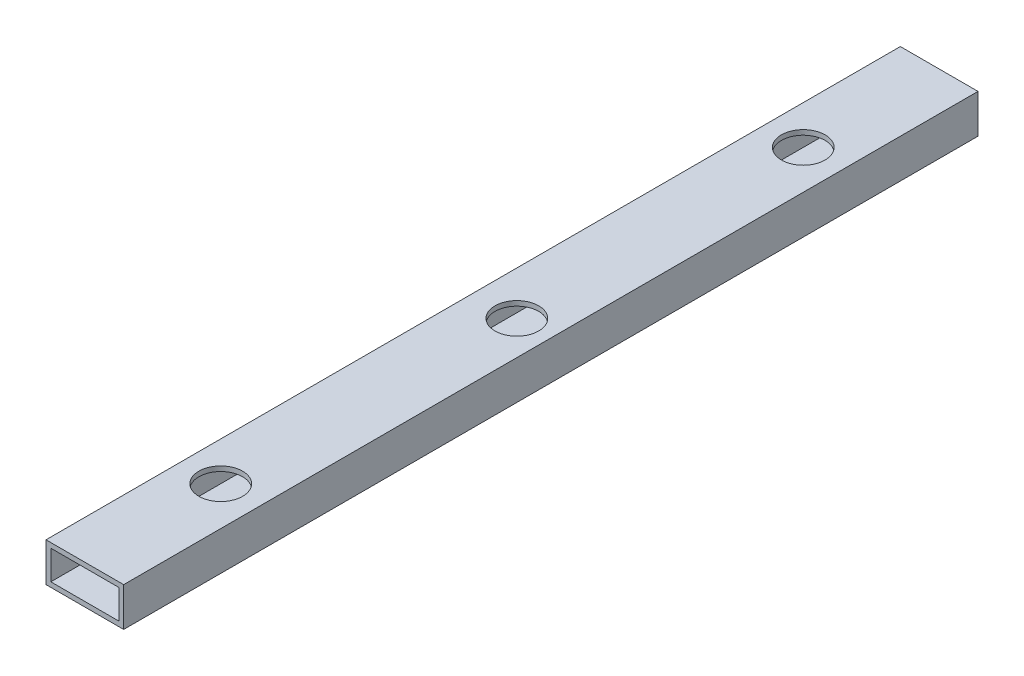
ISO-10303-21;
HEADER;
FILE_DESCRIPTION(('STEP AP214'),'2;1');
FILE_NAME('part.step','',(''),(''),'','','');
FILE_SCHEMA(('AUTOMOTIVE_DESIGN { 1 0 10303 214 1 1 1 1 }'));
ENDSEC;
DATA;
#1=APPLICATION_CONTEXT('core data for automotive mechanical design processes');
#2=APPLICATION_PROTOCOL_DEFINITION('international standard','automotive_design',2000,#1);
#3=PRODUCT_CONTEXT('',#1,'mechanical');
#4=PRODUCT('Part','Part','',(#3));
#5=PRODUCT_RELATED_PRODUCT_CATEGORY('part','',(#4));
#6=PRODUCT_DEFINITION_FORMATION('','',#4);
#7=PRODUCT_DEFINITION_CONTEXT('part definition',#1,'design');
#8=PRODUCT_DEFINITION('design','',#6,#7);
#9=PRODUCT_DEFINITION_SHAPE('','',#8);
#10=(LENGTH_UNIT() NAMED_UNIT(*) SI_UNIT(.MILLI.,.METRE.));
#11=(NAMED_UNIT(*) PLANE_ANGLE_UNIT() SI_UNIT($,.RADIAN.));
#12=(NAMED_UNIT(*) SI_UNIT($,.STERADIAN.) SOLID_ANGLE_UNIT());
#13=UNCERTAINTY_MEASURE_WITH_UNIT(LENGTH_MEASURE(1.E-05),#10,'distance_accuracy_value','');
#14=(GEOMETRIC_REPRESENTATION_CONTEXT(3) GLOBAL_UNCERTAINTY_ASSIGNED_CONTEXT((#13)) GLOBAL_UNIT_ASSIGNED_CONTEXT((#10,
#11,#12)) REPRESENTATION_CONTEXT('',''));
#15=CARTESIAN_POINT('',(0.,0.,0.));
#16=DIRECTION('',(0.,0.,1.));
#17=DIRECTION('',(1.,0.,0.));
#18=AXIS2_PLACEMENT_3D('',#15,#16,#17);
#19=CARTESIAN_POINT('',(0.,0.,558.8));
#20=DIRECTION('',(0.,0.,-1.));
#21=DIRECTION('',(-1.,0.,0.));
#22=AXIS2_PLACEMENT_3D('',#19,#20,#21);
#23=PLANE('',#22);
#24=DIRECTION('',(0.,-1.,0.));
#25=VECTOR('',#24,1.);
#26=CARTESIAN_POINT('',(0.,0.,558.8));
#27=LINE('',#26,#25);
#28=CARTESIAN_POINT('',(0.,25.4,558.8));
#29=VERTEX_POINT('',#28);
#30=CARTESIAN_POINT('',(0.,0.,558.8));
#31=VERTEX_POINT('',#30);
#32=EDGE_CURVE('E138',#29,#31,#27,.T.);
#33=ORIENTED_EDGE('',*,*,#32,.T.);
#34=DIRECTION('',(1.,0.,0.));
#35=VECTOR('',#34,1.);
#36=CARTESIAN_POINT('',(0.,0.,558.8));
#37=LINE('',#36,#35);
#38=CARTESIAN_POINT('',(50.8,0.,558.8));
#39=VERTEX_POINT('',#38);
#40=EDGE_CURVE('E141',#31,#39,#37,.T.);
#41=ORIENTED_EDGE('',*,*,#40,.T.);
#42=DIRECTION('',(0.,1.,0.));
#43=VECTOR('',#42,1.);
#44=CARTESIAN_POINT('',(50.8,0.,558.8));
#45=LINE('',#44,#43);
#46=CARTESIAN_POINT('',(50.8,25.4,558.8));
#47=VERTEX_POINT('',#46);
#48=EDGE_CURVE('E144',#39,#47,#45,.T.);
#49=ORIENTED_EDGE('',*,*,#48,.T.);
#50=DIRECTION('',(-1.,0.,0.));
#51=VECTOR('',#50,1.);
#52=CARTESIAN_POINT('',(0.,25.4,558.8));
#53=LINE('',#52,#51);
#54=EDGE_CURVE('E146',#47,#29,#53,.T.);
#55=ORIENTED_EDGE('',*,*,#54,.T.);
#56=EDGE_LOOP('',(#33,#41,#49,#55));
#57=FACE_BOUND('',#56,.T.);
#58=DIRECTION('',(0.,-1.,0.));
#59=VECTOR('',#58,1.);
#60=CARTESIAN_POINT('',(3.175,3.175,558.8));
#61=LINE('',#60,#59);
#62=CARTESIAN_POINT('',(3.175,22.225,558.8));
#63=VERTEX_POINT('',#62);
#64=CARTESIAN_POINT('',(3.175,3.175,558.8));
#65=VERTEX_POINT('',#64);
#66=EDGE_CURVE('E100',#63,#65,#61,.T.);
#67=ORIENTED_EDGE('',*,*,#66,.F.);
#68=DIRECTION('',(-1.,0.,0.));
#69=VECTOR('',#68,1.);
#70=CARTESIAN_POINT('',(3.175,22.225,558.8));
#71=LINE('',#70,#69);
#72=CARTESIAN_POINT('',(47.625,22.225,558.8));
#73=VERTEX_POINT('',#72);
#74=EDGE_CURVE('E122',#73,#63,#71,.T.);
#75=ORIENTED_EDGE('',*,*,#74,.F.);
#76=DIRECTION('',(0.,1.,0.));
#77=VECTOR('',#76,1.);
#78=CARTESIAN_POINT('',(47.625,3.175,558.8));
#79=LINE('',#78,#77);
#80=CARTESIAN_POINT('',(47.625,3.175,558.8));
#81=VERTEX_POINT('',#80);
#82=EDGE_CURVE('E120',#81,#73,#79,.T.);
#83=ORIENTED_EDGE('',*,*,#82,.F.);
#84=DIRECTION('',(1.,0.,0.));
#85=VECTOR('',#84,1.);
#86=CARTESIAN_POINT('',(3.175,3.175,558.8));
#87=LINE('',#86,#85);
#88=EDGE_CURVE('E108',#65,#81,#87,.T.);
#89=ORIENTED_EDGE('',*,*,#88,.F.);
#90=EDGE_LOOP('',(#67,#75,#83,#89));
#91=FACE_BOUND('',#90,.T.);
#92=ADVANCED_FACE('F33',(#57,#91),#23,.F.);
#93=CARTESIAN_POINT('',(0.,0.,0.));
#94=DIRECTION('',(0.,0.,-1.));
#95=DIRECTION('',(-1.,0.,0.));
#96=AXIS2_PLACEMENT_3D('',#93,#94,#95);
#97=PLANE('',#96);
#98=DIRECTION('',(0.,-1.,0.));
#99=VECTOR('',#98,1.);
#100=CARTESIAN_POINT('',(0.,0.,0.));
#101=LINE('',#100,#99);
#102=CARTESIAN_POINT('',(0.,25.4,0.));
#103=VERTEX_POINT('',#102);
#104=CARTESIAN_POINT('',(0.,0.,0.));
#105=VERTEX_POINT('',#104);
#106=EDGE_CURVE('E116',#103,#105,#101,.T.);
#107=ORIENTED_EDGE('',*,*,#106,.F.);
#108=DIRECTION('',(-1.,0.,0.));
#109=VECTOR('',#108,1.);
#110=CARTESIAN_POINT('',(0.,25.4,0.));
#111=LINE('',#110,#109);
#112=CARTESIAN_POINT('',(50.8,25.4,0.));
#113=VERTEX_POINT('',#112);
#114=EDGE_CURVE('E142',#113,#103,#111,.T.);
#115=ORIENTED_EDGE('',*,*,#114,.F.);
#116=DIRECTION('',(0.,1.,0.));
#117=VECTOR('',#116,1.);
#118=CARTESIAN_POINT('',(50.8,0.,0.));
#119=LINE('',#118,#117);
#120=CARTESIAN_POINT('',(50.8,0.,0.));
#121=VERTEX_POINT('',#120);
#122=EDGE_CURVE('E153',#121,#113,#119,.T.);
#123=ORIENTED_EDGE('',*,*,#122,.F.);
#124=DIRECTION('',(1.,0.,0.));
#125=VECTOR('',#124,1.);
#126=CARTESIAN_POINT('',(0.,0.,0.));
#127=LINE('',#126,#125);
#128=EDGE_CURVE('E151',#105,#121,#127,.T.);
#129=ORIENTED_EDGE('',*,*,#128,.F.);
#130=EDGE_LOOP('',(#107,#115,#123,#129));
#131=FACE_BOUND('',#130,.T.);
#132=DIRECTION('',(-1.,0.,0.));
#133=VECTOR('',#132,1.);
#134=CARTESIAN_POINT('',(3.175,22.225,0.));
#135=LINE('',#134,#133);
#136=CARTESIAN_POINT('',(47.625,22.225,0.));
#137=VERTEX_POINT('',#136);
#138=CARTESIAN_POINT('',(3.175,22.225,0.));
#139=VERTEX_POINT('',#138);
#140=EDGE_CURVE('E109',#137,#139,#135,.T.);
#141=ORIENTED_EDGE('',*,*,#140,.T.);
#142=DIRECTION('',(0.,-1.,0.));
#143=VECTOR('',#142,1.);
#144=CARTESIAN_POINT('',(3.175,3.175,0.));
#145=LINE('',#144,#143);
#146=CARTESIAN_POINT('',(3.175,3.175,0.));
#147=VERTEX_POINT('',#146);
#148=EDGE_CURVE('E58',#139,#147,#145,.T.);
#149=ORIENTED_EDGE('',*,*,#148,.T.);
#150=DIRECTION('',(1.,0.,0.));
#151=VECTOR('',#150,1.);
#152=CARTESIAN_POINT('',(3.175,3.175,0.));
#153=LINE('',#152,#151);
#154=CARTESIAN_POINT('',(47.625,3.175,0.));
#155=VERTEX_POINT('',#154);
#156=EDGE_CURVE('E115',#147,#155,#153,.T.);
#157=ORIENTED_EDGE('',*,*,#156,.T.);
#158=DIRECTION('',(0.,1.,0.));
#159=VECTOR('',#158,1.);
#160=CARTESIAN_POINT('',(47.625,3.175,0.));
#161=LINE('',#160,#159);
#162=EDGE_CURVE('E130',#155,#137,#161,.T.);
#163=ORIENTED_EDGE('',*,*,#162,.T.);
#164=EDGE_LOOP('',(#141,#149,#157,#163));
#165=FACE_BOUND('',#164,.T.);
#166=ADVANCED_FACE('F211',(#131,#165),#97,.T.);
#167=CARTESIAN_POINT('',(0.,0.,558.8));
#168=DIRECTION('',(1.,0.,0.));
#169=DIRECTION('',(0.,0.,-1.));
#170=AXIS2_PLACEMENT_3D('',#167,#168,#169);
#171=PLANE('',#170);
#172=ORIENTED_EDGE('',*,*,#106,.T.);
#173=DIRECTION('',(0.,0.,-1.));
#174=VECTOR('',#173,1.);
#175=CARTESIAN_POINT('',(0.,0.,558.8));
#176=LINE('',#175,#174);
#177=EDGE_CURVE('E11',#31,#105,#176,.T.);
#178=ORIENTED_EDGE('',*,*,#177,.F.);
#179=ORIENTED_EDGE('',*,*,#32,.F.);
#180=DIRECTION('',(0.,0.,-1.));
#181=VECTOR('',#180,1.);
#182=CARTESIAN_POINT('',(0.,25.4,558.8));
#183=LINE('',#182,#181);
#184=EDGE_CURVE('E148',#29,#103,#183,.T.);
#185=ORIENTED_EDGE('',*,*,#184,.T.);
#186=EDGE_LOOP('',(#172,#178,#179,#185));
#187=FACE_BOUND('',#186,.T.);
#188=ADVANCED_FACE('F35',(#187),#171,.F.);
#189=CARTESIAN_POINT('',(0.,0.,558.8));
#190=DIRECTION('',(0.,1.,0.));
#191=DIRECTION('',(0.,0.,1.));
#192=AXIS2_PLACEMENT_3D('',#189,#190,#191);
#193=PLANE('',#192);
#194=CARTESIAN_POINT('',(25.4000000000001,0.,88.9));
#195=DIRECTION('',(0.,1.,0.));
#196=DIRECTION('',(0.,0.,-1.));
#197=AXIS2_PLACEMENT_3D('',#194,#195,#196);
#198=CIRCLE('',#197,14.2875);
#199=CARTESIAN_POINT('',(25.4000000000001,0.,74.6125));
#200=VERTEX_POINT('',#199);
#201=EDGE_CURVE('E235',#200,#200,#198,.T.);
#202=ORIENTED_EDGE('',*,*,#201,.T.);
#203=EDGE_LOOP('',(#202));
#204=FACE_BOUND('',#203,.T.);
#205=CARTESIAN_POINT('',(25.4000000000001,0.,469.9));
#206=DIRECTION('',(0.,1.,0.));
#207=DIRECTION('',(0.,0.,1.));
#208=AXIS2_PLACEMENT_3D('',#205,#206,#207);
#209=CIRCLE('',#208,14.2875);
#210=CARTESIAN_POINT('',(25.4000000000001,0.,484.1875));
#211=VERTEX_POINT('',#210);
#212=EDGE_CURVE('E169',#211,#211,#209,.T.);
#213=ORIENTED_EDGE('',*,*,#212,.T.);
#214=EDGE_LOOP('',(#213));
#215=FACE_BOUND('',#214,.T.);
#216=CARTESIAN_POINT('',(28.575,0.,279.4));
#217=DIRECTION('',(0.,1.,0.));
#218=DIRECTION('',(0.,0.,1.));
#219=AXIS2_PLACEMENT_3D('',#216,#217,#218);
#220=CIRCLE('',#219,14.2875);
#221=CARTESIAN_POINT('',(28.575,0.,293.6875));
#222=VERTEX_POINT('',#221);
#223=EDGE_CURVE('E165',#222,#222,#220,.T.);
#224=ORIENTED_EDGE('',*,*,#223,.T.);
#225=EDGE_LOOP('',(#224));
#226=FACE_BOUND('',#225,.T.);
#227=ORIENTED_EDGE('',*,*,#128,.T.);
#228=DIRECTION('',(0.,0.,-1.));
#229=VECTOR('',#228,1.);
#230=CARTESIAN_POINT('',(50.8,0.,558.8));
#231=LINE('',#230,#229);
#232=EDGE_CURVE('E42',#39,#121,#231,.T.);
#233=ORIENTED_EDGE('',*,*,#232,.F.);
#234=ORIENTED_EDGE('',*,*,#40,.F.);
#235=ORIENTED_EDGE('',*,*,#177,.T.);
#236=EDGE_LOOP('',(#227,#233,#234,#235));
#237=FACE_BOUND('',#236,.T.);
#238=ADVANCED_FACE('F225',(#204,#215,#226,#237),#193,.F.);
#239=CARTESIAN_POINT('',(50.8,0.,558.8));
#240=DIRECTION('',(-1.,0.,0.));
#241=DIRECTION('',(0.,0.,1.));
#242=AXIS2_PLACEMENT_3D('',#239,#240,#241);
#243=PLANE('',#242);
#244=ORIENTED_EDGE('',*,*,#122,.T.);
#245=DIRECTION('',(0.,0.,-1.));
#246=VECTOR('',#245,1.);
#247=CARTESIAN_POINT('',(50.8,25.4,558.8));
#248=LINE('',#247,#246);
#249=EDGE_CURVE('E158',#47,#113,#248,.T.);
#250=ORIENTED_EDGE('',*,*,#249,.F.);
#251=ORIENTED_EDGE('',*,*,#48,.F.);
#252=ORIENTED_EDGE('',*,*,#232,.T.);
#253=EDGE_LOOP('',(#244,#250,#251,#252));
#254=FACE_BOUND('',#253,.T.);
#255=ADVANCED_FACE('F222',(#254),#243,.F.);
#256=CARTESIAN_POINT('',(0.,25.4,558.8));
#257=DIRECTION('',(0.,-1.,0.));
#258=DIRECTION('',(0.,0.,-1.));
#259=AXIS2_PLACEMENT_3D('',#256,#257,#258);
#260=PLANE('',#259);
#261=CARTESIAN_POINT('',(25.4000000000001,25.4,88.9));
#262=DIRECTION('',(0.,1.,0.));
#263=DIRECTION('',(0.,0.,-1.));
#264=AXIS2_PLACEMENT_3D('',#261,#262,#263);
#265=CIRCLE('',#264,14.2875);
#266=CARTESIAN_POINT('',(25.4000000000001,25.4,74.6125));
#267=VERTEX_POINT('',#266);
#268=EDGE_CURVE('E282',#267,#267,#265,.T.);
#269=ORIENTED_EDGE('',*,*,#268,.F.);
#270=EDGE_LOOP('',(#269));
#271=FACE_BOUND('',#270,.T.);
#272=CARTESIAN_POINT('',(25.4000000000001,25.4,469.9));
#273=DIRECTION('',(0.,1.,0.));
#274=DIRECTION('',(0.,0.,1.));
#275=AXIS2_PLACEMENT_3D('',#272,#273,#274);
#276=CIRCLE('',#275,14.2875);
#277=CARTESIAN_POINT('',(25.4000000000001,25.4,484.1875));
#278=VERTEX_POINT('',#277);
#279=EDGE_CURVE('E176',#278,#278,#276,.T.);
#280=ORIENTED_EDGE('',*,*,#279,.F.);
#281=EDGE_LOOP('',(#280));
#282=FACE_BOUND('',#281,.T.);
#283=CARTESIAN_POINT('',(28.575,25.4,279.4));
#284=DIRECTION('',(0.,1.,0.));
#285=DIRECTION('',(0.,0.,1.));
#286=AXIS2_PLACEMENT_3D('',#283,#284,#285);
#287=CIRCLE('',#286,14.2875);
#288=CARTESIAN_POINT('',(28.575,25.4,293.6875));
#289=VERTEX_POINT('',#288);
#290=EDGE_CURVE('E173',#289,#289,#287,.T.);
#291=ORIENTED_EDGE('',*,*,#290,.F.);
#292=EDGE_LOOP('',(#291));
#293=FACE_BOUND('',#292,.T.);
#294=ORIENTED_EDGE('',*,*,#114,.T.);
#295=ORIENTED_EDGE('',*,*,#184,.F.);
#296=ORIENTED_EDGE('',*,*,#54,.F.);
#297=ORIENTED_EDGE('',*,*,#249,.T.);
#298=EDGE_LOOP('',(#294,#295,#296,#297));
#299=FACE_BOUND('',#298,.T.);
#300=ADVANCED_FACE('F206',(#271,#282,#293,#299),#260,.F.);
#301=CARTESIAN_POINT('',(3.175,3.175,558.8));
#302=DIRECTION('',(1.,0.,0.));
#303=DIRECTION('',(0.,0.,-1.));
#304=AXIS2_PLACEMENT_3D('',#301,#302,#303);
#305=PLANE('',#304);
#306=ORIENTED_EDGE('',*,*,#148,.F.);
#307=DIRECTION('',(0.,0.,-1.));
#308=VECTOR('',#307,1.);
#309=CARTESIAN_POINT('',(3.175,22.225,558.8));
#310=LINE('',#309,#308);
#311=EDGE_CURVE('E104',#63,#139,#310,.T.);
#312=ORIENTED_EDGE('',*,*,#311,.F.);
#313=ORIENTED_EDGE('',*,*,#66,.T.);
#314=DIRECTION('',(0.,0.,-1.));
#315=VECTOR('',#314,1.);
#316=CARTESIAN_POINT('',(3.175,3.175,558.8));
#317=LINE('',#316,#315);
#318=EDGE_CURVE('E103',#65,#147,#317,.T.);
#319=ORIENTED_EDGE('',*,*,#318,.T.);
#320=EDGE_LOOP('',(#306,#312,#313,#319));
#321=FACE_BOUND('',#320,.T.);
#322=ADVANCED_FACE('F102',(#321),#305,.T.);
#323=CARTESIAN_POINT('',(3.175,3.175,558.8));
#324=DIRECTION('',(0.,1.,0.));
#325=DIRECTION('',(0.,0.,1.));
#326=AXIS2_PLACEMENT_3D('',#323,#324,#325);
#327=PLANE('',#326);
#328=CARTESIAN_POINT('',(25.4000000000001,3.175,88.9));
#329=DIRECTION('',(0.,1.,0.));
#330=DIRECTION('',(0.,0.,1.));
#331=AXIS2_PLACEMENT_3D('',#328,#329,#330);
#332=CIRCLE('',#331,14.2875);
#333=CARTESIAN_POINT('',(25.4000000000001,3.175,103.1875));
#334=VERTEX_POINT('',#333);
#335=EDGE_CURVE('E181',#334,#334,#332,.T.);
#336=ORIENTED_EDGE('',*,*,#335,.F.);
#337=EDGE_LOOP('',(#336));
#338=FACE_BOUND('',#337,.T.);
#339=CARTESIAN_POINT('',(25.4000000000001,3.175,469.9));
#340=DIRECTION('',(0.,1.,0.));
#341=DIRECTION('',(0.,0.,1.));
#342=AXIS2_PLACEMENT_3D('',#339,#340,#341);
#343=CIRCLE('',#342,14.2875);
#344=CARTESIAN_POINT('',(25.4000000000001,3.175,484.1875));
#345=VERTEX_POINT('',#344);
#346=EDGE_CURVE('E168',#345,#345,#343,.T.);
#347=ORIENTED_EDGE('',*,*,#346,.F.);
#348=EDGE_LOOP('',(#347));
#349=FACE_BOUND('',#348,.T.);
#350=CARTESIAN_POINT('',(28.575,3.175,279.4));
#351=DIRECTION('',(0.,1.,0.));
#352=DIRECTION('',(0.,0.,1.));
#353=AXIS2_PLACEMENT_3D('',#350,#351,#352);
#354=CIRCLE('',#353,14.2875);
#355=CARTESIAN_POINT('',(28.575,3.175,293.6875));
#356=VERTEX_POINT('',#355);
#357=EDGE_CURVE('E128',#356,#356,#354,.T.);
#358=ORIENTED_EDGE('',*,*,#357,.F.);
#359=EDGE_LOOP('',(#358));
#360=FACE_BOUND('',#359,.T.);
#361=ORIENTED_EDGE('',*,*,#156,.F.);
#362=ORIENTED_EDGE('',*,*,#318,.F.);
#363=ORIENTED_EDGE('',*,*,#88,.T.);
#364=DIRECTION('',(0.,0.,-1.));
#365=VECTOR('',#364,1.);
#366=CARTESIAN_POINT('',(47.625,3.175,558.8));
#367=LINE('',#366,#365);
#368=EDGE_CURVE('E117',#81,#155,#367,.T.);
#369=ORIENTED_EDGE('',*,*,#368,.T.);
#370=EDGE_LOOP('',(#361,#362,#363,#369));
#371=FACE_BOUND('',#370,.T.);
#372=ADVANCED_FACE('F112',(#338,#349,#360,#371),#327,.T.);
#373=CARTESIAN_POINT('',(47.625,3.175,558.8));
#374=DIRECTION('',(-1.,0.,0.));
#375=DIRECTION('',(0.,0.,1.));
#376=AXIS2_PLACEMENT_3D('',#373,#374,#375);
#377=PLANE('',#376);
#378=ORIENTED_EDGE('',*,*,#162,.F.);
#379=ORIENTED_EDGE('',*,*,#368,.F.);
#380=ORIENTED_EDGE('',*,*,#82,.T.);
#381=DIRECTION('',(0.,0.,-1.));
#382=VECTOR('',#381,1.);
#383=CARTESIAN_POINT('',(47.625,22.225,558.8));
#384=LINE('',#383,#382);
#385=EDGE_CURVE('E50',#73,#137,#384,.T.);
#386=ORIENTED_EDGE('',*,*,#385,.T.);
#387=EDGE_LOOP('',(#378,#379,#380,#386));
#388=FACE_BOUND('',#387,.T.);
#389=ADVANCED_FACE('F196',(#388),#377,.T.);
#390=CARTESIAN_POINT('',(3.175,22.225,558.8));
#391=DIRECTION('',(0.,-1.,0.));
#392=DIRECTION('',(0.,0.,-1.));
#393=AXIS2_PLACEMENT_3D('',#390,#391,#392);
#394=PLANE('',#393);
#395=CARTESIAN_POINT('',(25.4000000000001,22.225,88.9));
#396=DIRECTION('',(0.,-1.,0.));
#397=DIRECTION('',(0.,0.,-1.));
#398=AXIS2_PLACEMENT_3D('',#395,#396,#397);
#399=CIRCLE('',#398,14.2875);
#400=CARTESIAN_POINT('',(25.4000000000001,22.225,74.6125));
#401=VERTEX_POINT('',#400);
#402=EDGE_CURVE('E37',#401,#401,#399,.T.);
#403=ORIENTED_EDGE('',*,*,#402,.F.);
#404=EDGE_LOOP('',(#403));
#405=FACE_BOUND('',#404,.T.);
#406=CARTESIAN_POINT('',(25.4000000000001,22.225,469.9));
#407=DIRECTION('',(0.,-1.,0.));
#408=DIRECTION('',(0.,0.,-1.));
#409=AXIS2_PLACEMENT_3D('',#406,#407,#408);
#410=CIRCLE('',#409,14.2875);
#411=CARTESIAN_POINT('',(25.4000000000001,22.225,455.6125));
#412=VERTEX_POINT('',#411);
#413=EDGE_CURVE('E166',#412,#412,#410,.T.);
#414=ORIENTED_EDGE('',*,*,#413,.F.);
#415=EDGE_LOOP('',(#414));
#416=FACE_BOUND('',#415,.T.);
#417=CARTESIAN_POINT('',(28.575,22.225,279.4));
#418=DIRECTION('',(0.,-1.,0.));
#419=DIRECTION('',(0.,0.,-1.));
#420=AXIS2_PLACEMENT_3D('',#417,#418,#419);
#421=CIRCLE('',#420,14.2875);
#422=CARTESIAN_POINT('',(28.575,22.225,265.1125));
#423=VERTEX_POINT('',#422);
#424=EDGE_CURVE('E163',#423,#423,#421,.T.);
#425=ORIENTED_EDGE('',*,*,#424,.F.);
#426=EDGE_LOOP('',(#425));
#427=FACE_BOUND('',#426,.T.);
#428=ORIENTED_EDGE('',*,*,#140,.F.);
#429=ORIENTED_EDGE('',*,*,#385,.F.);
#430=ORIENTED_EDGE('',*,*,#74,.T.);
#431=ORIENTED_EDGE('',*,*,#311,.T.);
#432=EDGE_LOOP('',(#428,#429,#430,#431));
#433=FACE_BOUND('',#432,.T.);
#434=ADVANCED_FACE('F203',(#405,#416,#427,#433),#394,.T.);
#435=CARTESIAN_POINT('',(28.575,0.,279.4));
#436=DIRECTION('',(0.,1.,0.));
#437=DIRECTION('',(0.,0.,1.));
#438=AXIS2_PLACEMENT_3D('',#435,#436,#437);
#439=CYLINDRICAL_SURFACE('',#438,14.2875);
#440=ORIENTED_EDGE('',*,*,#424,.T.);
#441=EDGE_LOOP('',(#440));
#442=FACE_BOUND('',#441,.T.);
#443=ORIENTED_EDGE('',*,*,#290,.T.);
#444=EDGE_LOOP('',(#443));
#445=FACE_BOUND('',#444,.T.);
#446=ADVANCED_FACE('F253',(#442,#445),#439,.F.);
#447=ORIENTED_EDGE('',*,*,#357,.T.);
#448=EDGE_LOOP('',(#447));
#449=FACE_BOUND('',#448,.T.);
#450=ORIENTED_EDGE('',*,*,#223,.F.);
#451=EDGE_LOOP('',(#450));
#452=FACE_BOUND('',#451,.T.);
#453=ADVANCED_FACE('F192',(#449,#452),#439,.F.);
#454=CARTESIAN_POINT('',(25.4000000000001,0.,469.9));
#455=DIRECTION('',(0.,1.,0.));
#456=DIRECTION('',(0.,0.,1.));
#457=AXIS2_PLACEMENT_3D('',#454,#455,#456);
#458=CYLINDRICAL_SURFACE('',#457,14.2875);
#459=ORIENTED_EDGE('',*,*,#413,.T.);
#460=EDGE_LOOP('',(#459));
#461=FACE_BOUND('',#460,.T.);
#462=ORIENTED_EDGE('',*,*,#279,.T.);
#463=EDGE_LOOP('',(#462));
#464=FACE_BOUND('',#463,.T.);
#465=ADVANCED_FACE('F264',(#461,#464),#458,.F.);
#466=ORIENTED_EDGE('',*,*,#346,.T.);
#467=EDGE_LOOP('',(#466));
#468=FACE_BOUND('',#467,.T.);
#469=ORIENTED_EDGE('',*,*,#212,.F.);
#470=EDGE_LOOP('',(#469));
#471=FACE_BOUND('',#470,.T.);
#472=ADVANCED_FACE('F267',(#468,#471),#458,.F.);
#473=CARTESIAN_POINT('',(25.4000000000001,0.,88.9));
#474=DIRECTION('',(0.,1.,0.));
#475=DIRECTION('',(0.,0.,1.));
#476=AXIS2_PLACEMENT_3D('',#473,#474,#475);
#477=CYLINDRICAL_SURFACE('',#476,14.2875);
#478=ORIENTED_EDGE('',*,*,#402,.T.);
#479=EDGE_LOOP('',(#478));
#480=FACE_BOUND('',#479,.T.);
#481=ORIENTED_EDGE('',*,*,#268,.T.);
#482=EDGE_LOOP('',(#481));
#483=FACE_BOUND('',#482,.T.);
#484=ADVANCED_FACE('F268',(#480,#483),#477,.F.);
#485=ORIENTED_EDGE('',*,*,#335,.T.);
#486=EDGE_LOOP('',(#485));
#487=FACE_BOUND('',#486,.T.);
#488=ORIENTED_EDGE('',*,*,#201,.F.);
#489=EDGE_LOOP('',(#488));
#490=FACE_BOUND('',#489,.T.);
#491=ADVANCED_FACE('F270',(#487,#490),#477,.F.);
#492=CLOSED_SHELL('',(#92,#166,#188,#238,#255,#300,#322,#372,#389,#434,#446,#453,#465,#472,#484,#491));
#493=MANIFOLD_SOLID_BREP('B2',#492);
#494=ADVANCED_BREP_SHAPE_REPRESENTATION('',(#18,#493),#14);
#495=SHAPE_DEFINITION_REPRESENTATION(#9,#494);
ENDSEC;
END-ISO-10303-21;
